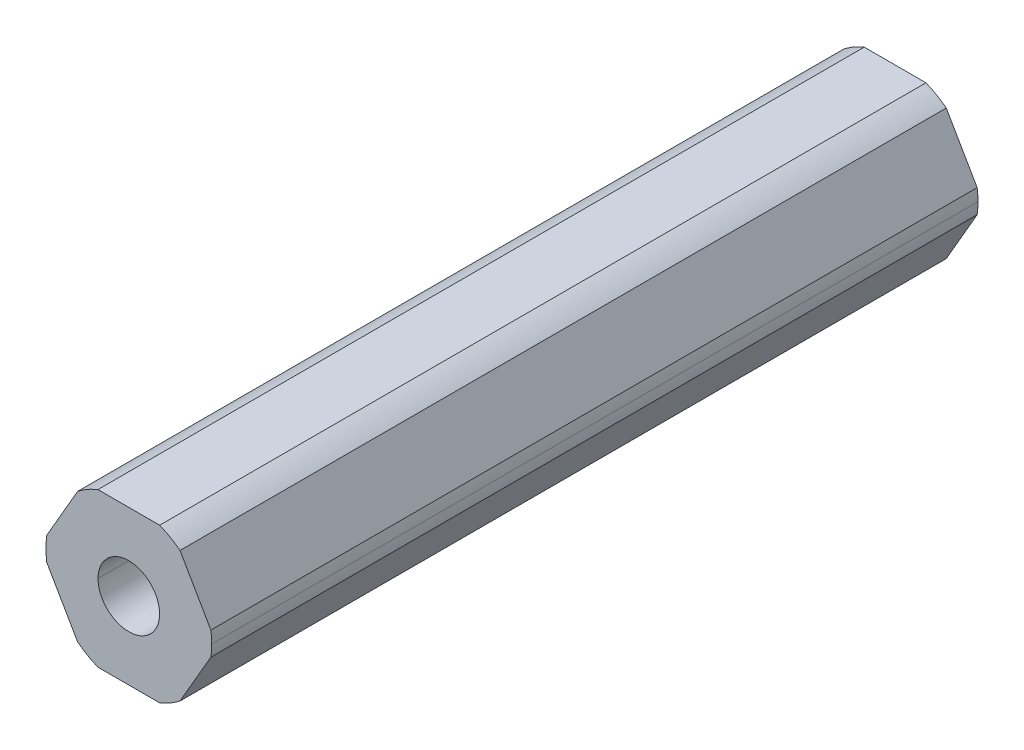
ISO-10303-21;
HEADER;
FILE_DESCRIPTION(('STEP AP214'),'2;1');
FILE_NAME('part.step','',(''),(''),'','','');
FILE_SCHEMA(('AUTOMOTIVE_DESIGN { 1 0 10303 214 1 1 1 1 }'));
ENDSEC;
DATA;
#1=APPLICATION_CONTEXT('core data for automotive mechanical design processes');
#2=APPLICATION_PROTOCOL_DEFINITION('international standard','automotive_design',2000,#1);
#3=PRODUCT_CONTEXT('',#1,'mechanical');
#4=PRODUCT('Part','Part','',(#3));
#5=PRODUCT_RELATED_PRODUCT_CATEGORY('part','',(#4));
#6=PRODUCT_DEFINITION_FORMATION('','',#4);
#7=PRODUCT_DEFINITION_CONTEXT('part definition',#1,'design');
#8=PRODUCT_DEFINITION('design','',#6,#7);
#9=PRODUCT_DEFINITION_SHAPE('','',#8);
#10=(LENGTH_UNIT() NAMED_UNIT(*) SI_UNIT(.MILLI.,.METRE.));
#11=(NAMED_UNIT(*) PLANE_ANGLE_UNIT() SI_UNIT($,.RADIAN.));
#12=(NAMED_UNIT(*) SI_UNIT($,.STERADIAN.) SOLID_ANGLE_UNIT());
#13=UNCERTAINTY_MEASURE_WITH_UNIT(LENGTH_MEASURE(1.E-05),#10,'distance_accuracy_value','');
#14=(GEOMETRIC_REPRESENTATION_CONTEXT(3) GLOBAL_UNCERTAINTY_ASSIGNED_CONTEXT((#13)) GLOBAL_UNIT_ASSIGNED_CONTEXT((#10,
#11,#12)) REPRESENTATION_CONTEXT('',''));
#15=CARTESIAN_POINT('',(0.,0.,0.));
#16=DIRECTION('',(0.,0.,1.));
#17=DIRECTION('',(1.,0.,0.));
#18=AXIS2_PLACEMENT_3D('',#15,#16,#17);
#19=CARTESIAN_POINT('',(0.,0.,-457.2));
#20=DIRECTION('',(0.,0.,1.));
#21=DIRECTION('',(1.,0.,0.));
#22=AXIS2_PLACEMENT_3D('',#19,#20,#21);
#23=CYLINDRICAL_SURFACE('',#22,2.55);
#24=DIRECTION('',(0.,0.,1.));
#25=VECTOR('',#24,1.);
#26=CARTESIAN_POINT('',(2.55,0.,-457.2));
#27=LINE('',#26,#25);
#28=CARTESIAN_POINT('',(2.55,0.,-457.2));
#29=VERTEX_POINT('',#28);
#30=CARTESIAN_POINT('',(2.55,0.,-393.7));
#31=VERTEX_POINT('',#30);
#32=EDGE_CURVE('E267',#29,#31,#27,.T.);
#33=ORIENTED_EDGE('',*,*,#32,.T.);
#34=CARTESIAN_POINT('',(0.,0.,-393.7));
#35=DIRECTION('',(0.,0.,-1.));
#36=DIRECTION('',(-1.,0.,0.));
#37=AXIS2_PLACEMENT_3D('',#34,#35,#36);
#38=CIRCLE('',#37,2.55);
#39=CARTESIAN_POINT('',(-2.55,0.,-393.7));
#40=VERTEX_POINT('',#39);
#41=EDGE_CURVE('E72',#31,#40,#38,.F.);
#42=ORIENTED_EDGE('',*,*,#41,.T.);
#43=DIRECTION('',(0.,0.,1.));
#44=VECTOR('',#43,1.);
#45=CARTESIAN_POINT('',(-2.55,0.,-457.2));
#46=LINE('',#45,#44);
#47=CARTESIAN_POINT('',(-2.55,0.,-457.2));
#48=VERTEX_POINT('',#47);
#49=EDGE_CURVE('E263',#48,#40,#46,.T.);
#50=ORIENTED_EDGE('',*,*,#49,.F.);
#51=CARTESIAN_POINT('',(0.,0.,-457.2));
#52=DIRECTION('',(0.,0.,1.));
#53=DIRECTION('',(1.,0.,0.));
#54=AXIS2_PLACEMENT_3D('',#51,#52,#53);
#55=CIRCLE('',#54,2.55);
#56=EDGE_CURVE('E58',#29,#48,#55,.T.);
#57=ORIENTED_EDGE('',*,*,#56,.F.);
#58=EDGE_LOOP('',(#33,#42,#50,#57));
#59=FACE_BOUND('',#58,.T.);
#60=ADVANCED_FACE('F49',(#59),#23,.F.);
#61=CARTESIAN_POINT('',(0.,0.,-457.2));
#62=DIRECTION('',(0.,0.,1.));
#63=DIRECTION('',(1.,0.,0.));
#64=AXIS2_PLACEMENT_3D('',#61,#62,#63);
#65=CYLINDRICAL_SURFACE('',#64,6.87);
#66=CARTESIAN_POINT('',(0.,0.,-393.7));
#67=DIRECTION('',(0.,0.,-1.));
#68=DIRECTION('',(-1.,0.,0.));
#69=AXIS2_PLACEMENT_3D('',#66,#67,#68);
#70=CIRCLE('',#69,6.87);
#71=CARTESIAN_POINT('',(4.24149521323254,5.40431479062105,-393.7));
#72=VERTEX_POINT('',#71);
#73=CARTESIAN_POINT('',(2.55952629210952,6.3754,-393.7));
#74=VERTEX_POINT('',#73);
#75=EDGE_CURVE('E169',#72,#74,#70,.F.);
#76=ORIENTED_EDGE('',*,*,#75,.F.);
#77=DIRECTION('',(0.,0.,-1.));
#78=VECTOR('',#77,1.);
#79=CARTESIAN_POINT('',(4.24149521323254,5.40431479062105,-457.2));
#80=LINE('',#79,#78);
#81=CARTESIAN_POINT('',(4.24149521323254,5.40431479062105,-457.2));
#82=VERTEX_POINT('',#81);
#83=EDGE_CURVE('E198',#72,#82,#80,.T.);
#84=ORIENTED_EDGE('',*,*,#83,.T.);
#85=CARTESIAN_POINT('',(0.,0.,-457.2));
#86=DIRECTION('',(0.,0.,1.));
#87=DIRECTION('',(1.,0.,0.));
#88=AXIS2_PLACEMENT_3D('',#85,#86,#87);
#89=CIRCLE('',#88,6.87);
#90=CARTESIAN_POINT('',(2.55952629210952,6.3754,-457.2));
#91=VERTEX_POINT('',#90);
#92=EDGE_CURVE('E194',#82,#91,#89,.T.);
#93=ORIENTED_EDGE('',*,*,#92,.T.);
#94=DIRECTION('',(0.,0.,1.));
#95=VECTOR('',#94,1.);
#96=CARTESIAN_POINT('',(2.55952629210952,6.3754,-457.2));
#97=LINE('',#96,#95);
#98=EDGE_CURVE('E187',#91,#74,#97,.T.);
#99=ORIENTED_EDGE('',*,*,#98,.T.);
#100=EDGE_LOOP('',(#76,#84,#93,#99));
#101=FACE_BOUND('',#100,.T.);
#102=ADVANCED_FACE('F192',(#101),#65,.T.);
#103=CARTESIAN_POINT('',(0.,0.,-457.2));
#104=DIRECTION('',(0.,0.,1.));
#105=DIRECTION('',(1.,0.,0.));
#106=AXIS2_PLACEMENT_3D('',#103,#104,#105);
#107=CYLINDRICAL_SURFACE('',#106,6.87);
#108=CARTESIAN_POINT('',(0.,0.,-393.7));
#109=DIRECTION('',(0.,0.,-1.));
#110=DIRECTION('',(-1.,0.,0.));
#111=AXIS2_PLACEMENT_3D('',#108,#109,#110);
#112=CIRCLE('',#111,6.87);
#113=CARTESIAN_POINT('',(-2.55952629210953,6.3754,-393.7));
#114=VERTEX_POINT('',#113);
#115=CARTESIAN_POINT('',(-4.24149521323254,5.40431479062105,-393.7));
#116=VERTEX_POINT('',#115);
#117=EDGE_CURVE('E328',#114,#116,#112,.F.);
#118=ORIENTED_EDGE('',*,*,#117,.F.);
#119=DIRECTION('',(0.,0.,-1.));
#120=VECTOR('',#119,1.);
#121=CARTESIAN_POINT('',(-2.55952629210953,6.3754,-457.2));
#122=LINE('',#121,#120);
#123=CARTESIAN_POINT('',(-2.55952629210953,6.3754,-457.2));
#124=VERTEX_POINT('',#123);
#125=EDGE_CURVE('E188',#114,#124,#122,.T.);
#126=ORIENTED_EDGE('',*,*,#125,.T.);
#127=CARTESIAN_POINT('',(0.,0.,-457.2));
#128=DIRECTION('',(0.,0.,1.));
#129=DIRECTION('',(1.,0.,0.));
#130=AXIS2_PLACEMENT_3D('',#127,#128,#129);
#131=CIRCLE('',#130,6.87);
#132=CARTESIAN_POINT('',(-4.24149521323255,5.40431479062105,-457.2));
#133=VERTEX_POINT('',#132);
#134=EDGE_CURVE('E302',#124,#133,#131,.T.);
#135=ORIENTED_EDGE('',*,*,#134,.T.);
#136=DIRECTION('',(0.,0.,1.));
#137=VECTOR('',#136,1.);
#138=CARTESIAN_POINT('',(-4.24149521323255,5.40431479062105,-457.2));
#139=LINE('',#138,#137);
#140=EDGE_CURVE('E211',#133,#116,#139,.T.);
#141=ORIENTED_EDGE('',*,*,#140,.T.);
#142=EDGE_LOOP('',(#118,#126,#135,#141));
#143=FACE_BOUND('',#142,.T.);
#144=ADVANCED_FACE('F526',(#143),#107,.T.);
#145=CARTESIAN_POINT('',(0.,0.,-457.2));
#146=DIRECTION('',(0.,0.,1.));
#147=DIRECTION('',(1.,0.,0.));
#148=AXIS2_PLACEMENT_3D('',#145,#146,#147);
#149=CYLINDRICAL_SURFACE('',#148,6.87);
#150=CARTESIAN_POINT('',(0.,0.,-393.7));
#151=DIRECTION('',(0.,0.,-1.));
#152=DIRECTION('',(-1.,0.,0.));
#153=AXIS2_PLACEMENT_3D('',#150,#151,#152);
#154=CIRCLE('',#153,6.87);
#155=CARTESIAN_POINT('',(-6.80102150534207,0.97108520937896,-393.7));
#156=VERTEX_POINT('',#155);
#157=CARTESIAN_POINT('',(-6.80102150534208,-0.971085209378956,-393.7));
#158=VERTEX_POINT('',#157);
#159=EDGE_CURVE('E332',#156,#158,#154,.F.);
#160=ORIENTED_EDGE('',*,*,#159,.F.);
#161=DIRECTION('',(0.,0.,-1.));
#162=VECTOR('',#161,1.);
#163=CARTESIAN_POINT('',(-6.80102150534208,0.97108520937896,-457.2));
#164=LINE('',#163,#162);
#165=CARTESIAN_POINT('',(-6.80102150534208,0.97108520937896,-457.2));
#166=VERTEX_POINT('',#165);
#167=EDGE_CURVE('E217',#156,#166,#164,.T.);
#168=ORIENTED_EDGE('',*,*,#167,.T.);
#169=CARTESIAN_POINT('',(0.,0.,-457.2));
#170=DIRECTION('',(0.,0.,1.));
#171=DIRECTION('',(1.,0.,0.));
#172=AXIS2_PLACEMENT_3D('',#169,#170,#171);
#173=CIRCLE('',#172,6.87);
#174=CARTESIAN_POINT('',(-6.80102150534208,-0.971085209378956,-457.2));
#175=VERTEX_POINT('',#174);
#176=EDGE_CURVE('E259',#166,#175,#173,.T.);
#177=ORIENTED_EDGE('',*,*,#176,.T.);
#178=DIRECTION('',(0.,0.,1.));
#179=VECTOR('',#178,1.);
#180=CARTESIAN_POINT('',(-6.80102150534208,-0.971085209378962,-457.2));
#181=LINE('',#180,#179);
#182=EDGE_CURVE('E212',#175,#158,#181,.T.);
#183=ORIENTED_EDGE('',*,*,#182,.T.);
#184=EDGE_LOOP('',(#160,#168,#177,#183));
#185=FACE_BOUND('',#184,.T.);
#186=ADVANCED_FACE('F316',(#185),#149,.T.);
#187=CARTESIAN_POINT('',(0.,0.,-457.2));
#188=DIRECTION('',(0.,0.,1.));
#189=DIRECTION('',(1.,0.,0.));
#190=AXIS2_PLACEMENT_3D('',#187,#188,#189);
#191=CYLINDRICAL_SURFACE('',#190,6.87);
#192=CARTESIAN_POINT('',(0.,0.,-393.7));
#193=DIRECTION('',(0.,0.,-1.));
#194=DIRECTION('',(-1.,0.,0.));
#195=AXIS2_PLACEMENT_3D('',#192,#193,#194);
#196=CIRCLE('',#195,6.87);
#197=CARTESIAN_POINT('',(-4.24149521323254,-5.40431479062105,-393.7));
#198=VERTEX_POINT('',#197);
#199=CARTESIAN_POINT('',(-2.55952629210953,-6.3754,-393.7));
#200=VERTEX_POINT('',#199);
#201=EDGE_CURVE('E264',#198,#200,#196,.F.);
#202=ORIENTED_EDGE('',*,*,#201,.F.);
#203=DIRECTION('',(0.,0.,-1.));
#204=VECTOR('',#203,1.);
#205=CARTESIAN_POINT('',(-4.24149521323255,-5.40431479062104,-457.2));
#206=LINE('',#205,#204);
#207=CARTESIAN_POINT('',(-4.24149521323254,-5.40431479062105,-457.2));
#208=VERTEX_POINT('',#207);
#209=EDGE_CURVE('E255',#198,#208,#206,.T.);
#210=ORIENTED_EDGE('',*,*,#209,.T.);
#211=CARTESIAN_POINT('',(0.,0.,-457.2));
#212=DIRECTION('',(0.,0.,1.));
#213=DIRECTION('',(1.,0.,0.));
#214=AXIS2_PLACEMENT_3D('',#211,#212,#213);
#215=CIRCLE('',#214,6.87);
#216=CARTESIAN_POINT('',(-2.55952629210953,-6.3754,-457.2));
#217=VERTEX_POINT('',#216);
#218=EDGE_CURVE('E256',#208,#217,#215,.T.);
#219=ORIENTED_EDGE('',*,*,#218,.T.);
#220=DIRECTION('',(0.,0.,1.));
#221=VECTOR('',#220,1.);
#222=CARTESIAN_POINT('',(-2.55952629210953,-6.3754,-457.2));
#223=LINE('',#222,#221);
#224=EDGE_CURVE('E245',#217,#200,#223,.T.);
#225=ORIENTED_EDGE('',*,*,#224,.T.);
#226=EDGE_LOOP('',(#202,#210,#219,#225));
#227=FACE_BOUND('',#226,.T.);
#228=ADVANCED_FACE('F363',(#227),#191,.T.);
#229=CARTESIAN_POINT('',(0.,0.,-457.2));
#230=DIRECTION('',(0.,0.,1.));
#231=DIRECTION('',(1.,0.,0.));
#232=AXIS2_PLACEMENT_3D('',#229,#230,#231);
#233=CYLINDRICAL_SURFACE('',#232,6.87);
#234=CARTESIAN_POINT('',(0.,0.,-393.7));
#235=DIRECTION('',(0.,0.,-1.));
#236=DIRECTION('',(-1.,0.,0.));
#237=AXIS2_PLACEMENT_3D('',#234,#235,#236);
#238=CIRCLE('',#237,6.87);
#239=CARTESIAN_POINT('',(2.55952629210953,-6.3754,-393.7));
#240=VERTEX_POINT('',#239);
#241=CARTESIAN_POINT('',(4.24149521323254,-5.40431479062105,-393.7));
#242=VERTEX_POINT('',#241);
#243=EDGE_CURVE('E342',#240,#242,#238,.F.);
#244=ORIENTED_EDGE('',*,*,#243,.F.);
#245=DIRECTION('',(0.,0.,-1.));
#246=VECTOR('',#245,1.);
#247=CARTESIAN_POINT('',(2.55952629210953,-6.3754,-457.2));
#248=LINE('',#247,#246);
#249=CARTESIAN_POINT('',(2.55952629210953,-6.3754,-457.2));
#250=VERTEX_POINT('',#249);
#251=EDGE_CURVE('E244',#240,#250,#248,.T.);
#252=ORIENTED_EDGE('',*,*,#251,.T.);
#253=CARTESIAN_POINT('',(0.,0.,-457.2));
#254=DIRECTION('',(0.,0.,1.));
#255=DIRECTION('',(1.,0.,0.));
#256=AXIS2_PLACEMENT_3D('',#253,#254,#255);
#257=CIRCLE('',#256,6.87);
#258=CARTESIAN_POINT('',(4.24149521323254,-5.40431479062105,-457.2));
#259=VERTEX_POINT('',#258);
#260=EDGE_CURVE('E220',#250,#259,#257,.T.);
#261=ORIENTED_EDGE('',*,*,#260,.T.);
#262=DIRECTION('',(0.,0.,1.));
#263=VECTOR('',#262,1.);
#264=CARTESIAN_POINT('',(4.24149521323255,-5.40431479062104,-457.2));
#265=LINE('',#264,#263);
#266=EDGE_CURVE('E296',#259,#242,#265,.T.);
#267=ORIENTED_EDGE('',*,*,#266,.T.);
#268=EDGE_LOOP('',(#244,#252,#261,#267));
#269=FACE_BOUND('',#268,.T.);
#270=ADVANCED_FACE('F369',(#269),#233,.T.);
#271=CARTESIAN_POINT('',(0.,0.,-457.2));
#272=DIRECTION('',(0.,0.,1.));
#273=DIRECTION('',(1.,0.,0.));
#274=AXIS2_PLACEMENT_3D('',#271,#272,#273);
#275=CYLINDRICAL_SURFACE('',#274,6.87);
#276=CARTESIAN_POINT('',(0.,0.,-393.7));
#277=DIRECTION('',(0.,0.,-1.));
#278=DIRECTION('',(-1.,0.,0.));
#279=AXIS2_PLACEMENT_3D('',#276,#277,#278);
#280=CIRCLE('',#279,6.87);
#281=CARTESIAN_POINT('',(6.87,0.,-393.7));
#282=VERTEX_POINT('',#281);
#283=CARTESIAN_POINT('',(6.80102150534208,0.97108520937895,-393.7));
#284=VERTEX_POINT('',#283);
#285=EDGE_CURVE('E345',#282,#284,#280,.F.);
#286=ORIENTED_EDGE('',*,*,#285,.F.);
#287=DIRECTION('',(0.,0.,1.));
#288=VECTOR('',#287,1.);
#289=CARTESIAN_POINT('',(6.87,0.,-457.2));
#290=LINE('',#289,#288);
#291=CARTESIAN_POINT('',(6.87,0.,-457.2));
#292=VERTEX_POINT('',#291);
#293=EDGE_CURVE('E277',#292,#282,#290,.T.);
#294=ORIENTED_EDGE('',*,*,#293,.F.);
#295=CARTESIAN_POINT('',(0.,0.,-457.2));
#296=DIRECTION('',(0.,0.,1.));
#297=DIRECTION('',(1.,0.,0.));
#298=AXIS2_PLACEMENT_3D('',#295,#296,#297);
#299=CIRCLE('',#298,6.87);
#300=CARTESIAN_POINT('',(6.80102150534208,0.97108520937895,-457.2));
#301=VERTEX_POINT('',#300);
#302=EDGE_CURVE('E218',#292,#301,#299,.T.);
#303=ORIENTED_EDGE('',*,*,#302,.T.);
#304=DIRECTION('',(0.,0.,1.));
#305=VECTOR('',#304,1.);
#306=CARTESIAN_POINT('',(6.80102150534208,0.971085209378949,-457.2));
#307=LINE('',#306,#305);
#308=EDGE_CURVE('E251',#301,#284,#307,.T.);
#309=ORIENTED_EDGE('',*,*,#308,.T.);
#310=EDGE_LOOP('',(#286,#294,#303,#309));
#311=FACE_BOUND('',#310,.T.);
#312=ADVANCED_FACE('F502',(#311),#275,.T.);
#313=CARTESIAN_POINT('',(0.,0.,-457.2));
#314=DIRECTION('',(0.,0.,1.));
#315=DIRECTION('',(1.,0.,0.));
#316=AXIS2_PLACEMENT_3D('',#313,#314,#315);
#317=PLANE('',#316);
#318=ORIENTED_EDGE('',*,*,#56,.T.);
#319=CARTESIAN_POINT('',(0.,0.,-457.2));
#320=DIRECTION('',(0.,0.,1.));
#321=DIRECTION('',(1.,0.,0.));
#322=AXIS2_PLACEMENT_3D('',#319,#320,#321);
#323=CIRCLE('',#322,2.55);
#324=EDGE_CURVE('E260',#48,#29,#323,.T.);
#325=ORIENTED_EDGE('',*,*,#324,.T.);
#326=EDGE_LOOP('',(#318,#325));
#327=FACE_BOUND('',#326,.T.);
#328=ORIENTED_EDGE('',*,*,#92,.F.);
#329=DIRECTION('',(-0.5,0.866025403784439,0.));
#330=VECTOR('',#329,1.);
#331=CARTESIAN_POINT('',(7.36167781238308,0.,-457.2));
#332=LINE('',#331,#330);
#333=EDGE_CURVE('E204',#301,#82,#332,.T.);
#334=ORIENTED_EDGE('',*,*,#333,.F.);
#335=ORIENTED_EDGE('',*,*,#302,.F.);
#336=CARTESIAN_POINT('',(0.,0.,-457.2));
#337=DIRECTION('',(0.,0.,1.));
#338=DIRECTION('',(1.,0.,0.));
#339=AXIS2_PLACEMENT_3D('',#336,#337,#338);
#340=CIRCLE('',#339,6.87);
#341=CARTESIAN_POINT('',(6.80102150534208,-0.971085209378955,-457.2));
#342=VERTEX_POINT('',#341);
#343=EDGE_CURVE('E270',#342,#292,#340,.T.);
#344=ORIENTED_EDGE('',*,*,#343,.F.);
#345=DIRECTION('',(0.5,0.866025403784439,0.));
#346=VECTOR('',#345,1.);
#347=CARTESIAN_POINT('',(3.68083890619154,-6.3754,-457.2));
#348=LINE('',#347,#346);
#349=EDGE_CURVE('E290',#259,#342,#348,.T.);
#350=ORIENTED_EDGE('',*,*,#349,.F.);
#351=ORIENTED_EDGE('',*,*,#260,.F.);
#352=DIRECTION('',(1.,0.,0.));
#353=VECTOR('',#352,1.);
#354=CARTESIAN_POINT('',(-3.68083890619154,-6.3754,-457.2));
#355=LINE('',#354,#353);
#356=EDGE_CURVE('E240',#217,#250,#355,.T.);
#357=ORIENTED_EDGE('',*,*,#356,.F.);
#358=ORIENTED_EDGE('',*,*,#218,.F.);
#359=DIRECTION('',(0.5,-0.866025403784439,0.));
#360=VECTOR('',#359,1.);
#361=CARTESIAN_POINT('',(-7.36167781238308,0.,-457.2));
#362=LINE('',#361,#360);
#363=EDGE_CURVE('E216',#175,#208,#362,.T.);
#364=ORIENTED_EDGE('',*,*,#363,.F.);
#365=ORIENTED_EDGE('',*,*,#176,.F.);
#366=DIRECTION('',(-0.5,-0.866025403784439,0.));
#367=VECTOR('',#366,1.);
#368=CARTESIAN_POINT('',(-3.68083890619154,6.3754,-457.2));
#369=LINE('',#368,#367);
#370=EDGE_CURVE('E223',#133,#166,#369,.T.);
#371=ORIENTED_EDGE('',*,*,#370,.F.);
#372=ORIENTED_EDGE('',*,*,#134,.F.);
#373=DIRECTION('',(-1.,0.,0.));
#374=VECTOR('',#373,1.);
#375=CARTESIAN_POINT('',(3.68083890619154,6.3754,-457.2));
#376=LINE('',#375,#374);
#377=EDGE_CURVE('E197',#91,#124,#376,.T.);
#378=ORIENTED_EDGE('',*,*,#377,.F.);
#379=EDGE_LOOP('',(#328,#334,#335,#344,#350,#351,#357,#358,#364,#365,#371,#372,#378));
#380=FACE_BOUND('',#379,.T.);
#381=ADVANCED_FACE('F320',(#327,#380),#317,.F.);
#382=CARTESIAN_POINT('',(-3.68083890619154,-6.3754,457.2));
#383=DIRECTION('',(0.,1.,0.));
#384=DIRECTION('',(1.,0.,0.));
#385=AXIS2_PLACEMENT_3D('',#382,#383,#384);
#386=PLANE('',#385);
#387=ORIENTED_EDGE('',*,*,#251,.F.);
#388=DIRECTION('',(-1.,0.,0.));
#389=VECTOR('',#388,1.);
#390=CARTESIAN_POINT('',(-23.0653966837621,-6.3754,-393.7));
#391=LINE('',#390,#389);
#392=EDGE_CURVE('E190',#240,#200,#391,.T.);
#393=ORIENTED_EDGE('',*,*,#392,.T.);
#394=ORIENTED_EDGE('',*,*,#224,.F.);
#395=ORIENTED_EDGE('',*,*,#356,.T.);
#396=EDGE_LOOP('',(#387,#393,#394,#395));
#397=FACE_BOUND('',#396,.T.);
#398=ADVANCED_FACE('F360',(#397),#386,.F.);
#399=CARTESIAN_POINT('',(-7.36167781238308,0.,457.2));
#400=DIRECTION('',(0.866025403784439,0.5,0.));
#401=DIRECTION('',(0.,0.,-1.));
#402=AXIS2_PLACEMENT_3D('',#399,#400,#401);
#403=PLANE('',#402);
#404=ORIENTED_EDGE('',*,*,#209,.F.);
#405=DIRECTION('',(-0.5,0.866025403784439,0.));
#406=VECTOR('',#405,1.);
#407=CARTESIAN_POINT('',(-7.36167781238308,0.,-393.7));
#408=LINE('',#407,#406);
#409=EDGE_CURVE('E325',#198,#158,#408,.T.);
#410=ORIENTED_EDGE('',*,*,#409,.T.);
#411=ORIENTED_EDGE('',*,*,#182,.F.);
#412=ORIENTED_EDGE('',*,*,#363,.T.);
#413=EDGE_LOOP('',(#404,#410,#411,#412));
#414=FACE_BOUND('',#413,.T.);
#415=ADVANCED_FACE('F51',(#414),#403,.F.);
#416=CARTESIAN_POINT('',(-3.68083890619154,6.3754,457.2));
#417=DIRECTION('',(0.866025403784439,-0.5,0.));
#418=DIRECTION('',(0.,0.,-1.));
#419=AXIS2_PLACEMENT_3D('',#416,#417,#418);
#420=PLANE('',#419);
#421=ORIENTED_EDGE('',*,*,#167,.F.);
#422=DIRECTION('',(0.5,0.866025403784439,0.));
#423=VECTOR('',#422,1.);
#424=CARTESIAN_POINT('',(-3.68083890619154,6.3754,-393.7));
#425=LINE('',#424,#423);
#426=EDGE_CURVE('E180',#156,#116,#425,.T.);
#427=ORIENTED_EDGE('',*,*,#426,.T.);
#428=ORIENTED_EDGE('',*,*,#140,.F.);
#429=ORIENTED_EDGE('',*,*,#370,.T.);
#430=EDGE_LOOP('',(#421,#427,#428,#429));
#431=FACE_BOUND('',#430,.T.);
#432=ADVANCED_FACE('F476',(#431),#420,.F.);
#433=CARTESIAN_POINT('',(3.68083890619154,6.3754,457.2));
#434=DIRECTION('',(0.,-1.,0.));
#435=DIRECTION('',(0.,0.,-1.));
#436=AXIS2_PLACEMENT_3D('',#433,#434,#435);
#437=PLANE('',#436);
#438=ORIENTED_EDGE('',*,*,#125,.F.);
#439=DIRECTION('',(-1.,0.,0.));
#440=VECTOR('',#439,1.);
#441=CARTESIAN_POINT('',(-23.0653966837621,6.3754,-393.7));
#442=LINE('',#441,#440);
#443=EDGE_CURVE('E172',#74,#114,#442,.T.);
#444=ORIENTED_EDGE('',*,*,#443,.F.);
#445=ORIENTED_EDGE('',*,*,#98,.F.);
#446=ORIENTED_EDGE('',*,*,#377,.T.);
#447=EDGE_LOOP('',(#438,#444,#445,#446));
#448=FACE_BOUND('',#447,.T.);
#449=ADVANCED_FACE('F185',(#448),#437,.F.);
#450=CARTESIAN_POINT('',(7.36167781238308,0.,457.2));
#451=DIRECTION('',(-0.866025403784439,-0.5,0.));
#452=DIRECTION('',(-0.5,0.866025403784439,0.));
#453=AXIS2_PLACEMENT_3D('',#450,#451,#452);
#454=PLANE('',#453);
#455=ORIENTED_EDGE('',*,*,#83,.F.);
#456=DIRECTION('',(0.5,-0.866025403784439,0.));
#457=VECTOR('',#456,1.);
#458=CARTESIAN_POINT('',(7.36167781238308,0.,-393.7));
#459=LINE('',#458,#457);
#460=EDGE_CURVE('E175',#72,#284,#459,.T.);
#461=ORIENTED_EDGE('',*,*,#460,.T.);
#462=ORIENTED_EDGE('',*,*,#308,.F.);
#463=ORIENTED_EDGE('',*,*,#333,.T.);
#464=EDGE_LOOP('',(#455,#461,#462,#463));
#465=FACE_BOUND('',#464,.T.);
#466=ADVANCED_FACE('F458',(#465),#454,.F.);
#467=CARTESIAN_POINT('',(3.68083890619154,-6.3754,457.2));
#468=DIRECTION('',(-0.866025403784439,0.5,0.));
#469=DIRECTION('',(0.,0.,1.));
#470=AXIS2_PLACEMENT_3D('',#467,#468,#469);
#471=PLANE('',#470);
#472=DIRECTION('',(0.,0.,-1.));
#473=VECTOR('',#472,1.);
#474=CARTESIAN_POINT('',(6.80102150534208,-0.971085209378962,-457.2));
#475=LINE('',#474,#473);
#476=CARTESIAN_POINT('',(6.80102150534208,-0.971085209378962,-393.7));
#477=VERTEX_POINT('',#476);
#478=EDGE_CURVE('E238',#477,#342,#475,.T.);
#479=ORIENTED_EDGE('',*,*,#478,.F.);
#480=DIRECTION('',(-0.5,-0.866025403784439,0.));
#481=VECTOR('',#480,1.);
#482=CARTESIAN_POINT('',(3.68083890619154,-6.3754,-393.7));
#483=LINE('',#482,#481);
#484=EDGE_CURVE('E65',#477,#242,#483,.T.);
#485=ORIENTED_EDGE('',*,*,#484,.T.);
#486=ORIENTED_EDGE('',*,*,#266,.F.);
#487=ORIENTED_EDGE('',*,*,#349,.T.);
#488=EDGE_LOOP('',(#479,#485,#486,#487));
#489=FACE_BOUND('',#488,.T.);
#490=ADVANCED_FACE('F372',(#489),#471,.F.);
#491=CARTESIAN_POINT('',(0.,0.,-457.2));
#492=DIRECTION('',(0.,0.,1.));
#493=DIRECTION('',(1.,0.,0.));
#494=AXIS2_PLACEMENT_3D('',#491,#492,#493);
#495=CYLINDRICAL_SURFACE('',#494,6.87);
#496=CARTESIAN_POINT('',(0.,0.,-393.7));
#497=DIRECTION('',(0.,0.,-1.));
#498=DIRECTION('',(-1.,0.,0.));
#499=AXIS2_PLACEMENT_3D('',#496,#497,#498);
#500=CIRCLE('',#499,6.87);
#501=EDGE_CURVE('E350',#477,#282,#500,.F.);
#502=ORIENTED_EDGE('',*,*,#501,.F.);
#503=ORIENTED_EDGE('',*,*,#478,.T.);
#504=ORIENTED_EDGE('',*,*,#343,.T.);
#505=ORIENTED_EDGE('',*,*,#293,.T.);
#506=EDGE_LOOP('',(#502,#503,#504,#505));
#507=FACE_BOUND('',#506,.T.);
#508=ADVANCED_FACE('F441',(#507),#495,.T.);
#509=CARTESIAN_POINT('',(0.,0.,-457.2));
#510=DIRECTION('',(0.,0.,1.));
#511=DIRECTION('',(1.,0.,0.));
#512=AXIS2_PLACEMENT_3D('',#509,#510,#511);
#513=CYLINDRICAL_SURFACE('',#512,2.55);
#514=ORIENTED_EDGE('',*,*,#49,.T.);
#515=CARTESIAN_POINT('',(0.,0.,-393.7));
#516=DIRECTION('',(0.,0.,-1.));
#517=DIRECTION('',(-1.,0.,0.));
#518=AXIS2_PLACEMENT_3D('',#515,#516,#517);
#519=CIRCLE('',#518,2.55);
#520=EDGE_CURVE('E11',#40,#31,#519,.F.);
#521=ORIENTED_EDGE('',*,*,#520,.T.);
#522=ORIENTED_EDGE('',*,*,#32,.F.);
#523=ORIENTED_EDGE('',*,*,#324,.F.);
#524=EDGE_LOOP('',(#514,#521,#522,#523));
#525=FACE_BOUND('',#524,.T.);
#526=ADVANCED_FACE('F430',(#525),#513,.F.);
#527=CARTESIAN_POINT('',(-23.0653966837621,-6.3754,-393.7));
#528=DIRECTION('',(0.,0.,-1.));
#529=DIRECTION('',(-1.,0.,0.));
#530=AXIS2_PLACEMENT_3D('',#527,#528,#529);
#531=PLANE('',#530);
#532=ORIENTED_EDGE('',*,*,#201,.T.);
#533=ORIENTED_EDGE('',*,*,#392,.F.);
#534=ORIENTED_EDGE('',*,*,#243,.T.);
#535=ORIENTED_EDGE('',*,*,#484,.F.);
#536=ORIENTED_EDGE('',*,*,#501,.T.);
#537=ORIENTED_EDGE('',*,*,#285,.T.);
#538=ORIENTED_EDGE('',*,*,#460,.F.);
#539=ORIENTED_EDGE('',*,*,#75,.T.);
#540=ORIENTED_EDGE('',*,*,#443,.T.);
#541=ORIENTED_EDGE('',*,*,#117,.T.);
#542=ORIENTED_EDGE('',*,*,#426,.F.);
#543=ORIENTED_EDGE('',*,*,#159,.T.);
#544=ORIENTED_EDGE('',*,*,#409,.F.);
#545=EDGE_LOOP('',(#532,#533,#534,#535,#536,#537,#538,#539,#540,#541,#542,#543,#544));
#546=FACE_BOUND('',#545,.T.);
#547=ORIENTED_EDGE('',*,*,#520,.F.);
#548=ORIENTED_EDGE('',*,*,#41,.F.);
#549=EDGE_LOOP('',(#547,#548));
#550=FACE_BOUND('',#549,.T.);
#551=ADVANCED_FACE('F171',(#546,#550),#531,.F.);
#552=CLOSED_SHELL('',(#60,#102,#144,#186,#228,#270,#312,#381,#398,#415,#432,#449,#466,#490,#508,
#526,#551));
#553=MANIFOLD_SOLID_BREP('B2',#552);
#554=ADVANCED_BREP_SHAPE_REPRESENTATION('',(#18,#553),#14);
#555=SHAPE_DEFINITION_REPRESENTATION(#9,#554);
ENDSEC;
END-ISO-10303-21;
